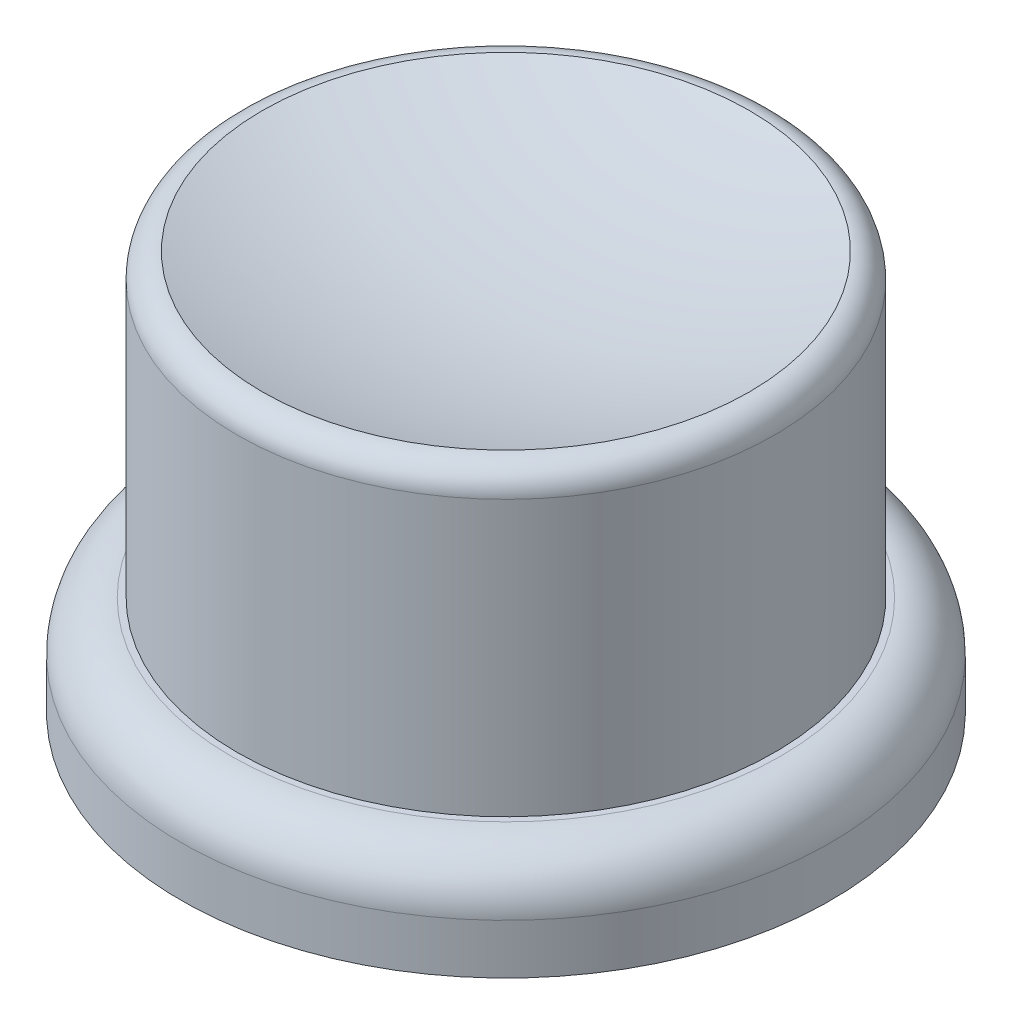
ISO-10303-21;
HEADER;
FILE_DESCRIPTION(('STEP AP214'),'2;1');
FILE_NAME('part.step','',(''),(''),'','','');
FILE_SCHEMA(('AUTOMOTIVE_DESIGN { 1 0 10303 214 1 1 1 1 }'));
ENDSEC;
DATA;
#1=APPLICATION_CONTEXT('core data for automotive mechanical design processes');
#2=APPLICATION_PROTOCOL_DEFINITION('international standard','automotive_design',2000,#1);
#3=PRODUCT_CONTEXT('',#1,'mechanical');
#4=PRODUCT('Part','Part','',(#3));
#5=PRODUCT_RELATED_PRODUCT_CATEGORY('part','',(#4));
#6=PRODUCT_DEFINITION_FORMATION('','',#4);
#7=PRODUCT_DEFINITION_CONTEXT('part definition',#1,'design');
#8=PRODUCT_DEFINITION('design','',#6,#7);
#9=PRODUCT_DEFINITION_SHAPE('','',#8);
#10=(LENGTH_UNIT() NAMED_UNIT(*) SI_UNIT(.MILLI.,.METRE.));
#11=(NAMED_UNIT(*) PLANE_ANGLE_UNIT() SI_UNIT($,.RADIAN.));
#12=(NAMED_UNIT(*) SI_UNIT($,.STERADIAN.) SOLID_ANGLE_UNIT());
#13=UNCERTAINTY_MEASURE_WITH_UNIT(LENGTH_MEASURE(1.E-05),#10,'distance_accuracy_value','');
#14=(GEOMETRIC_REPRESENTATION_CONTEXT(3) GLOBAL_UNCERTAINTY_ASSIGNED_CONTEXT((#13)) GLOBAL_UNIT_ASSIGNED_CONTEXT((#10,
#11,#12)) REPRESENTATION_CONTEXT('',''));
#15=CARTESIAN_POINT('',(0.,0.,0.));
#16=DIRECTION('',(0.,0.,1.));
#17=DIRECTION('',(1.,0.,0.));
#18=AXIS2_PLACEMENT_3D('',#15,#16,#17);
#19=CARTESIAN_POINT('',(0.,6.,0.));
#20=DIRECTION('',(0.,-1.,0.));
#21=DIRECTION('',(0.,0.,-1.));
#22=AXIS2_PLACEMENT_3D('',#19,#20,#21);
#23=CYLINDRICAL_SURFACE('',#22,5.375);
#24=CARTESIAN_POINT('',(0.,5.5,0.));
#25=DIRECTION('',(0.,1.,0.));
#26=DIRECTION('',(0.,0.,1.));
#27=AXIS2_PLACEMENT_3D('',#24,#25,#26);
#28=CIRCLE('',#27,5.375);
#29=CARTESIAN_POINT('',(0.,5.5,5.375));
#30=VERTEX_POINT('',#29);
#31=EDGE_CURVE('E11',#30,#30,#28,.F.);
#32=ORIENTED_EDGE('',*,*,#31,.T.);
#33=EDGE_LOOP('',(#32));
#34=FACE_BOUND('',#33,.T.);
#35=CARTESIAN_POINT('',(0.,0.,0.));
#36=DIRECTION('',(0.,1.,0.));
#37=DIRECTION('',(0.,0.,1.));
#38=AXIS2_PLACEMENT_3D('',#35,#36,#37);
#39=CIRCLE('',#38,5.375);
#40=CARTESIAN_POINT('',(0.,0.,5.375));
#41=VERTEX_POINT('',#40);
#42=EDGE_CURVE('E63',#41,#41,#39,.T.);
#43=ORIENTED_EDGE('',*,*,#42,.T.);
#44=EDGE_LOOP('',(#43));
#45=FACE_BOUND('',#44,.T.);
#46=ADVANCED_FACE('F43',(#34,#45),#23,.T.);
#47=CARTESIAN_POINT('',(0.,-2.,0.));
#48=DIRECTION('',(0.,1.,0.));
#49=DIRECTION('',(0.,0.,1.));
#50=AXIS2_PLACEMENT_3D('',#47,#48,#49);
#51=CYLINDRICAL_SURFACE('',#50,6.5);
#52=CARTESIAN_POINT('',(0.,-1.,0.));
#53=DIRECTION('',(0.,-1.,0.));
#54=DIRECTION('',(0.,0.,-1.));
#55=AXIS2_PLACEMENT_3D('',#52,#53,#54);
#56=CIRCLE('',#55,6.5);
#57=CARTESIAN_POINT('',(0.,-1.,-6.5));
#58=VERTEX_POINT('',#57);
#59=EDGE_CURVE('E54',#58,#58,#56,.T.);
#60=ORIENTED_EDGE('',*,*,#59,.T.);
#61=EDGE_LOOP('',(#60));
#62=FACE_BOUND('',#61,.T.);
#63=CARTESIAN_POINT('',(0.,-2.,0.));
#64=DIRECTION('',(0.,-1.,0.));
#65=DIRECTION('',(0.,0.,-1.));
#66=AXIS2_PLACEMENT_3D('',#63,#64,#65);
#67=CIRCLE('',#66,6.5);
#68=CARTESIAN_POINT('',(0.,-2.,-6.5));
#69=VERTEX_POINT('',#68);
#70=EDGE_CURVE('E66',#69,#69,#67,.T.);
#71=ORIENTED_EDGE('',*,*,#70,.F.);
#72=EDGE_LOOP('',(#71));
#73=FACE_BOUND('',#72,.T.);
#74=ADVANCED_FACE('F95',(#62,#73),#51,.T.);
#75=CARTESIAN_POINT('',(0.,-2.,0.));
#76=DIRECTION('',(0.,-1.,0.));
#77=DIRECTION('',(0.,0.,-1.));
#78=AXIS2_PLACEMENT_3D('',#75,#76,#77);
#79=PLANE('',#78);
#80=CARTESIAN_POINT('',(0.,-2.,0.));
#81=DIRECTION('',(0.,-1.,0.));
#82=DIRECTION('',(0.,0.,-1.));
#83=AXIS2_PLACEMENT_3D('',#80,#81,#82);
#84=CIRCLE('',#83,5.5);
#85=CARTESIAN_POINT('',(0.,-2.,-5.5));
#86=VERTEX_POINT('',#85);
#87=EDGE_CURVE('E70',#86,#86,#84,.T.);
#88=ORIENTED_EDGE('',*,*,#87,.F.);
#89=EDGE_LOOP('',(#88));
#90=FACE_BOUND('',#89,.T.);
#91=ORIENTED_EDGE('',*,*,#70,.T.);
#92=EDGE_LOOP('',(#91));
#93=FACE_BOUND('',#92,.T.);
#94=ADVANCED_FACE('F101',(#90,#93),#79,.T.);
#95=CARTESIAN_POINT('',(0.,0.,0.));
#96=DIRECTION('',(0.,-1.,0.));
#97=DIRECTION('',(0.,0.,-1.));
#98=AXIS2_PLACEMENT_3D('',#95,#96,#97);
#99=PLANE('',#98);
#100=CARTESIAN_POINT('',(0.,0.,0.));
#101=DIRECTION('',(0.,-1.,0.));
#102=DIRECTION('',(0.,0.,-1.));
#103=AXIS2_PLACEMENT_3D('',#100,#101,#102);
#104=CIRCLE('',#103,5.5);
#105=CARTESIAN_POINT('',(0.,0.,-5.5));
#106=VERTEX_POINT('',#105);
#107=EDGE_CURVE('E50',#106,#106,#104,.F.);
#108=ORIENTED_EDGE('',*,*,#107,.T.);
#109=EDGE_LOOP('',(#108));
#110=FACE_BOUND('',#109,.T.);
#111=ORIENTED_EDGE('',*,*,#42,.F.);
#112=EDGE_LOOP('',(#111));
#113=FACE_BOUND('',#112,.T.);
#114=ADVANCED_FACE('F106',(#110,#113),#99,.F.);
#115=CARTESIAN_POINT('',(0.,6.,0.));
#116=DIRECTION('',(0.,-1.,0.));
#117=DIRECTION('',(0.,0.,-1.));
#118=AXIS2_PLACEMENT_3D('',#115,#116,#117);
#119=CYLINDRICAL_SURFACE('',#118,4.375);
#120=CARTESIAN_POINT('',(0.,0.5,0.));
#121=DIRECTION('',(0.,-1.,0.));
#122=DIRECTION('',(0.,0.,-1.));
#123=AXIS2_PLACEMENT_3D('',#120,#121,#122);
#124=CIRCLE('',#123,4.375);
#125=CARTESIAN_POINT('',(0.,0.5,-4.375));
#126=VERTEX_POINT('',#125);
#127=EDGE_CURVE('E58',#126,#126,#124,.T.);
#128=ORIENTED_EDGE('',*,*,#127,.F.);
#129=EDGE_LOOP('',(#128));
#130=FACE_BOUND('',#129,.T.);
#131=CARTESIAN_POINT('',(0.,-1.,0.));
#132=DIRECTION('',(0.,-1.,0.));
#133=DIRECTION('',(0.,0.,-1.));
#134=AXIS2_PLACEMENT_3D('',#131,#132,#133);
#135=CIRCLE('',#134,4.375);
#136=CARTESIAN_POINT('',(0.,-1.,-4.375));
#137=VERTEX_POINT('',#136);
#138=EDGE_CURVE('E69',#137,#137,#135,.F.);
#139=ORIENTED_EDGE('',*,*,#138,.F.);
#140=EDGE_LOOP('',(#139));
#141=FACE_BOUND('',#140,.T.);
#142=ADVANCED_FACE('F109',(#130,#141),#119,.F.);
#143=CARTESIAN_POINT('',(0.,-2.,0.));
#144=DIRECTION('',(0.,1.,0.));
#145=DIRECTION('',(0.,0.,1.));
#146=AXIS2_PLACEMENT_3D('',#143,#144,#145);
#147=CYLINDRICAL_SURFACE('',#146,5.5);
#148=ORIENTED_EDGE('',*,*,#87,.T.);
#149=EDGE_LOOP('',(#148));
#150=FACE_BOUND('',#149,.T.);
#151=CARTESIAN_POINT('',(0.,-1.,0.));
#152=DIRECTION('',(0.,-1.,0.));
#153=DIRECTION('',(0.,0.,-1.));
#154=AXIS2_PLACEMENT_3D('',#151,#152,#153);
#155=CIRCLE('',#154,5.5);
#156=CARTESIAN_POINT('',(0.,-1.,-5.5));
#157=VERTEX_POINT('',#156);
#158=EDGE_CURVE('E73',#157,#157,#155,.T.);
#159=ORIENTED_EDGE('',*,*,#158,.F.);
#160=EDGE_LOOP('',(#159));
#161=FACE_BOUND('',#160,.T.);
#162=ADVANCED_FACE('F116',(#150,#161),#147,.F.);
#163=CARTESIAN_POINT('',(0.,-1.,0.));
#164=DIRECTION('',(0.,-1.,0.));
#165=DIRECTION('',(0.,0.,-1.));
#166=AXIS2_PLACEMENT_3D('',#163,#164,#165);
#167=PLANE('',#166);
#168=ORIENTED_EDGE('',*,*,#138,.T.);
#169=EDGE_LOOP('',(#168));
#170=FACE_BOUND('',#169,.T.);
#171=ORIENTED_EDGE('',*,*,#158,.T.);
#172=EDGE_LOOP('',(#171));
#173=FACE_BOUND('',#172,.T.);
#174=ADVANCED_FACE('F113',(#170,#173),#167,.T.);
#175=CARTESIAN_POINT('',(0.,0.5,0.));
#176=DIRECTION('',(0.,-1.,0.));
#177=DIRECTION('',(0.,0.,-1.));
#178=AXIS2_PLACEMENT_3D('',#175,#176,#177);
#179=PLANE('',#178);
#180=ORIENTED_EDGE('',*,*,#127,.T.);
#181=EDGE_LOOP('',(#180));
#182=FACE_BOUND('',#181,.T.);
#183=ADVANCED_FACE('F92',(#182),#179,.T.);
#184=CARTESIAN_POINT('',(0.,-1.,0.));
#185=DIRECTION('',(0.,-1.,0.));
#186=DIRECTION('',(0.,0.,-1.));
#187=AXIS2_PLACEMENT_3D('',#184,#185,#186);
#188=TOROIDAL_SURFACE('',#187,5.5,1.);
#189=ORIENTED_EDGE('',*,*,#107,.F.);
#190=EDGE_LOOP('',(#189));
#191=FACE_BOUND('',#190,.T.);
#192=ORIENTED_EDGE('',*,*,#59,.F.);
#193=EDGE_LOOP('',(#192));
#194=FACE_BOUND('',#193,.T.);
#195=ADVANCED_FACE('F85',(#191,#194),#188,.T.);
#196=CARTESIAN_POINT('',(0.,5.5,0.));
#197=DIRECTION('',(0.,1.,0.));
#198=DIRECTION('',(0.,0.,1.));
#199=AXIS2_PLACEMENT_3D('',#196,#197,#198);
#200=TOROIDAL_SURFACE('',#199,4.875,0.5);
#201=ORIENTED_EDGE('',*,*,#31,.F.);
#202=EDGE_LOOP('',(#201));
#203=FACE_BOUND('',#202,.T.);
#204=CARTESIAN_POINT('',(0.,6.,0.));
#205=DIRECTION('',(0.,1.,0.));
#206=DIRECTION('',(0.,0.,1.));
#207=AXIS2_PLACEMENT_3D('',#204,#205,#206);
#208=CIRCLE('',#207,4.87500000000001);
#209=CARTESIAN_POINT('',(0.,6.,4.87500000000001));
#210=VERTEX_POINT('',#209);
#211=EDGE_CURVE('E76',#210,#210,#208,.T.);
#212=ORIENTED_EDGE('',*,*,#211,.F.);
#213=EDGE_LOOP('',(#212));
#214=FACE_BOUND('',#213,.T.);
#215=ADVANCED_FACE('F45',(#203,#214),#200,.T.);
#216=CARTESIAN_POINT('',(0.,20.,0.));
#217=DIRECTION('',(0.,1.,0.));
#218=DIRECTION('',(1.,0.,0.));
#219=AXIS2_PLACEMENT_3D('',#216,#217,#218);
#220=SPHERICAL_SURFACE('',#219,14.8244940891755);
#221=ORIENTED_EDGE('',*,*,#211,.T.);
#222=EDGE_LOOP('',(#221));
#223=FACE_BOUND('',#222,.T.);
#224=ADVANCED_FACE('F82',(#223),#220,.F.);
#225=CLOSED_SHELL('',(#46,#74,#94,#114,#142,#162,#174,#183,#195,#215,#224));
#226=MANIFOLD_SOLID_BREP('B2',#225);
#227=ADVANCED_BREP_SHAPE_REPRESENTATION('',(#18,#226),#14);
#228=SHAPE_DEFINITION_REPRESENTATION(#9,#227);
ENDSEC;
END-ISO-10303-21;
